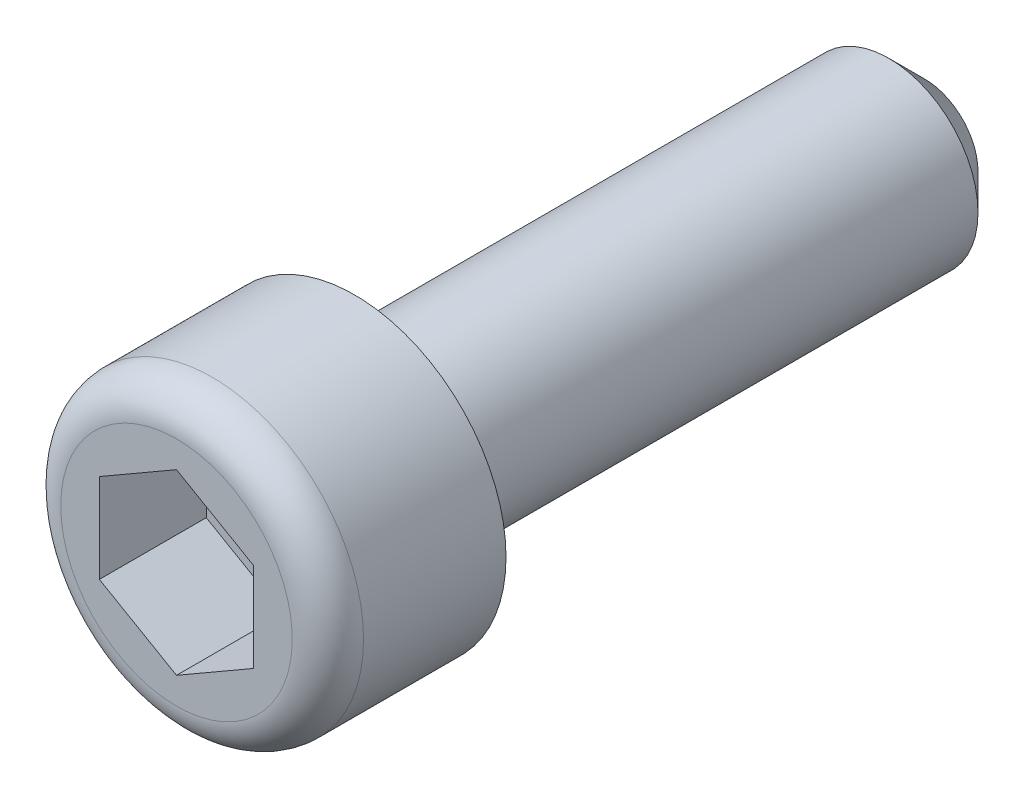
ISO-10303-21;
HEADER;
FILE_DESCRIPTION(('STEP AP214'),'2;1');
FILE_NAME('part.step','',(''),(''),'','','');
FILE_SCHEMA(('AUTOMOTIVE_DESIGN { 1 0 10303 214 1 1 1 1 }'));
ENDSEC;
DATA;
#1=APPLICATION_CONTEXT('core data for automotive mechanical design processes');
#2=APPLICATION_PROTOCOL_DEFINITION('international standard','automotive_design',2000,#1);
#3=PRODUCT_CONTEXT('',#1,'mechanical');
#4=PRODUCT('Part','Part','',(#3));
#5=PRODUCT_RELATED_PRODUCT_CATEGORY('part','',(#4));
#6=PRODUCT_DEFINITION_FORMATION('','',#4);
#7=PRODUCT_DEFINITION_CONTEXT('part definition',#1,'design');
#8=PRODUCT_DEFINITION('design','',#6,#7);
#9=PRODUCT_DEFINITION_SHAPE('','',#8);
#10=(LENGTH_UNIT() NAMED_UNIT(*) SI_UNIT(.MILLI.,.METRE.));
#11=(NAMED_UNIT(*) PLANE_ANGLE_UNIT() SI_UNIT($,.RADIAN.));
#12=(NAMED_UNIT(*) SI_UNIT($,.STERADIAN.) SOLID_ANGLE_UNIT());
#13=UNCERTAINTY_MEASURE_WITH_UNIT(LENGTH_MEASURE(1.E-05),#10,'distance_accuracy_value','');
#14=(GEOMETRIC_REPRESENTATION_CONTEXT(3) GLOBAL_UNCERTAINTY_ASSIGNED_CONTEXT((#13)) GLOBAL_UNIT_ASSIGNED_CONTEXT((#10,
#11,#12)) REPRESENTATION_CONTEXT('',''));
#15=CARTESIAN_POINT('',(0.,0.,0.));
#16=DIRECTION('',(0.,0.,1.));
#17=DIRECTION('',(1.,0.,0.));
#18=AXIS2_PLACEMENT_3D('',#15,#16,#17);
#19=CARTESIAN_POINT('',(0.,0.,0.));
#20=DIRECTION('',(0.,0.,-1.));
#21=DIRECTION('',(-1.,0.,0.));
#22=AXIS2_PLACEMENT_3D('',#19,#20,#21);
#23=PLANE('',#22);
#24=CARTESIAN_POINT('',(0.,0.,0.));
#25=DIRECTION('',(0.,0.,-1.));
#26=DIRECTION('',(-1.,0.,0.));
#27=AXIS2_PLACEMENT_3D('',#24,#25,#26);
#28=CIRCLE('',#27,3.25);
#29=CARTESIAN_POINT('',(-3.25,0.,0.));
#30=VERTEX_POINT('',#29);
#31=EDGE_CURVE('E41',#30,#30,#28,.F.);
#32=ORIENTED_EDGE('',*,*,#31,.T.);
#33=EDGE_LOOP('',(#32));
#34=FACE_BOUND('',#33,.T.);
#35=DIRECTION('',(-0.866025403784439,-0.5,0.));
#36=VECTOR('',#35,1.);
#37=CARTESIAN_POINT('',(0.,2.5,0.));
#38=LINE('',#37,#36);
#39=CARTESIAN_POINT('',(0.,2.5,0.));
#40=VERTEX_POINT('',#39);
#41=CARTESIAN_POINT('',(-2.1650635094611,1.25,0.));
#42=VERTEX_POINT('',#41);
#43=EDGE_CURVE('E122',#40,#42,#38,.T.);
#44=ORIENTED_EDGE('',*,*,#43,.F.);
#45=DIRECTION('',(-0.866025403784439,0.5,0.));
#46=VECTOR('',#45,1.);
#47=CARTESIAN_POINT('',(2.1650635094611,1.25,0.));
#48=LINE('',#47,#46);
#49=CARTESIAN_POINT('',(2.1650635094611,1.25,0.));
#50=VERTEX_POINT('',#49);
#51=EDGE_CURVE('E48',#50,#40,#48,.T.);
#52=ORIENTED_EDGE('',*,*,#51,.F.);
#53=DIRECTION('',(0.,1.,0.));
#54=VECTOR('',#53,1.);
#55=CARTESIAN_POINT('',(2.1650635094611,-1.25,0.));
#56=LINE('',#55,#54);
#57=CARTESIAN_POINT('',(2.1650635094611,-1.25,0.));
#58=VERTEX_POINT('',#57);
#59=EDGE_CURVE('E131',#58,#50,#56,.T.);
#60=ORIENTED_EDGE('',*,*,#59,.F.);
#61=DIRECTION('',(0.866025403784439,0.5,0.));
#62=VECTOR('',#61,1.);
#63=CARTESIAN_POINT('',(0.,-2.5,0.));
#64=LINE('',#63,#62);
#65=CARTESIAN_POINT('',(0.,-2.5,0.));
#66=VERTEX_POINT('',#65);
#67=EDGE_CURVE('E129',#66,#58,#64,.T.);
#68=ORIENTED_EDGE('',*,*,#67,.F.);
#69=DIRECTION('',(0.866025403784439,-0.5,0.));
#70=VECTOR('',#69,1.);
#71=CARTESIAN_POINT('',(-2.1650635094611,-1.25,0.));
#72=LINE('',#71,#70);
#73=CARTESIAN_POINT('',(-2.1650635094611,-1.25,0.));
#74=VERTEX_POINT('',#73);
#75=EDGE_CURVE('E96',#74,#66,#72,.T.);
#76=ORIENTED_EDGE('',*,*,#75,.F.);
#77=DIRECTION('',(0.,-1.,0.));
#78=VECTOR('',#77,1.);
#79=CARTESIAN_POINT('',(-2.1650635094611,1.25,0.));
#80=LINE('',#79,#78);
#81=EDGE_CURVE('E125',#42,#74,#80,.T.);
#82=ORIENTED_EDGE('',*,*,#81,.F.);
#83=EDGE_LOOP('',(#44,#52,#60,#68,#76,#82));
#84=FACE_BOUND('',#83,.T.);
#85=ADVANCED_FACE('F33',(#34,#84),#23,.F.);
#86=CARTESIAN_POINT('',(0.,0.,156.291575098795));
#87=DIRECTION('',(0.,0.,1.));
#88=DIRECTION('',(1.,0.,0.));
#89=AXIS2_PLACEMENT_3D('',#86,#87,#88);
#90=CYLINDRICAL_SURFACE('',#89,4.25);
#91=CARTESIAN_POINT('',(0.,0.,-1.));
#92=DIRECTION('',(0.,0.,-1.));
#93=DIRECTION('',(-1.,0.,0.));
#94=AXIS2_PLACEMENT_3D('',#91,#92,#93);
#95=CIRCLE('',#94,4.25);
#96=CARTESIAN_POINT('',(-4.25,0.,-1.));
#97=VERTEX_POINT('',#96);
#98=EDGE_CURVE('E11',#97,#97,#95,.T.);
#99=ORIENTED_EDGE('',*,*,#98,.T.);
#100=EDGE_LOOP('',(#99));
#101=FACE_BOUND('',#100,.T.);
#102=CARTESIAN_POINT('',(0.,0.,-5.));
#103=DIRECTION('',(0.,0.,1.));
#104=DIRECTION('',(1.,0.,0.));
#105=AXIS2_PLACEMENT_3D('',#102,#103,#104);
#106=CIRCLE('',#105,4.25);
#107=CARTESIAN_POINT('',(4.25,0.,-5.));
#108=VERTEX_POINT('',#107);
#109=EDGE_CURVE('E143',#108,#108,#106,.T.);
#110=ORIENTED_EDGE('',*,*,#109,.T.);
#111=EDGE_LOOP('',(#110));
#112=FACE_BOUND('',#111,.T.);
#113=ADVANCED_FACE('F165',(#101,#112),#90,.T.);
#114=CARTESIAN_POINT('',(0.,4.25,-5.));
#115=DIRECTION('',(0.,0.,1.));
#116=DIRECTION('',(1.,0.,0.));
#117=AXIS2_PLACEMENT_3D('',#114,#115,#116);
#118=PLANE('',#117);
#119=ORIENTED_EDGE('',*,*,#109,.F.);
#120=EDGE_LOOP('',(#119));
#121=FACE_BOUND('',#120,.T.);
#122=CARTESIAN_POINT('',(0.,0.,-5.));
#123=DIRECTION('',(0.,0.,1.));
#124=DIRECTION('',(1.,0.,0.));
#125=AXIS2_PLACEMENT_3D('',#122,#123,#124);
#126=CIRCLE('',#125,2.5);
#127=CARTESIAN_POINT('',(2.5,0.,-5.));
#128=VERTEX_POINT('',#127);
#129=EDGE_CURVE('E135',#128,#128,#126,.T.);
#130=ORIENTED_EDGE('',*,*,#129,.T.);
#131=EDGE_LOOP('',(#130));
#132=FACE_BOUND('',#131,.T.);
#133=ADVANCED_FACE('F170',(#121,#132),#118,.F.);
#134=CARTESIAN_POINT('',(0.,0.,156.291575098795));
#135=DIRECTION('',(0.,0.,1.));
#136=DIRECTION('',(1.,0.,0.));
#137=AXIS2_PLACEMENT_3D('',#134,#135,#136);
#138=CYLINDRICAL_SURFACE('',#137,2.5);
#139=CARTESIAN_POINT('',(0.,0.,-20.));
#140=DIRECTION('',(0.,0.,1.));
#141=DIRECTION('',(1.,0.,0.));
#142=AXIS2_PLACEMENT_3D('',#139,#140,#141);
#143=CIRCLE('',#142,2.5);
#144=CARTESIAN_POINT('',(2.5,0.,-20.));
#145=VERTEX_POINT('',#144);
#146=EDGE_CURVE('E146',#145,#145,#143,.T.);
#147=ORIENTED_EDGE('',*,*,#146,.T.);
#148=EDGE_LOOP('',(#147));
#149=FACE_BOUND('',#148,.T.);
#150=ORIENTED_EDGE('',*,*,#129,.F.);
#151=EDGE_LOOP('',(#150));
#152=FACE_BOUND('',#151,.T.);
#153=ADVANCED_FACE('F176',(#149,#152),#138,.T.);
#154=CARTESIAN_POINT('',(0.,2.5,-21.));
#155=DIRECTION('',(0.,0.,1.));
#156=DIRECTION('',(1.,0.,0.));
#157=AXIS2_PLACEMENT_3D('',#154,#155,#156);
#158=PLANE('',#157);
#159=CARTESIAN_POINT('',(0.,0.,-21.));
#160=DIRECTION('',(0.,0.,1.));
#161=DIRECTION('',(1.,0.,0.));
#162=AXIS2_PLACEMENT_3D('',#159,#160,#161);
#163=CIRCLE('',#162,1.49999999999999);
#164=CARTESIAN_POINT('',(1.49999999999999,0.,-21.));
#165=VERTEX_POINT('',#164);
#166=EDGE_CURVE('E149',#165,#165,#163,.F.);
#167=ORIENTED_EDGE('',*,*,#166,.T.);
#168=EDGE_LOOP('',(#167));
#169=FACE_BOUND('',#168,.T.);
#170=ADVANCED_FACE('F180',(#169),#158,.F.);
#171=CARTESIAN_POINT('',(2.1650635094611,1.25,-3.));
#172=DIRECTION('',(0.5,0.866025403784438,0.));
#173=DIRECTION('',(-0.866025403784439,0.5,0.));
#174=AXIS2_PLACEMENT_3D('',#171,#172,#173);
#175=PLANE('',#174);
#176=ORIENTED_EDGE('',*,*,#51,.T.);
#177=DIRECTION('',(0.,0.,1.));
#178=VECTOR('',#177,1.);
#179=CARTESIAN_POINT('',(0.,2.5,-3.));
#180=LINE('',#179,#178);
#181=CARTESIAN_POINT('',(0.,2.5,-3.));
#182=VERTEX_POINT('',#181);
#183=EDGE_CURVE('E78',#182,#40,#180,.T.);
#184=ORIENTED_EDGE('',*,*,#183,.F.);
#185=DIRECTION('',(-0.866025403784439,0.5,0.));
#186=VECTOR('',#185,1.);
#187=CARTESIAN_POINT('',(2.1650635094611,1.25,-3.));
#188=LINE('',#187,#186);
#189=CARTESIAN_POINT('',(2.1650635094611,1.25,-3.));
#190=VERTEX_POINT('',#189);
#191=EDGE_CURVE('E133',#190,#182,#188,.T.);
#192=ORIENTED_EDGE('',*,*,#191,.F.);
#193=DIRECTION('',(0.,0.,1.));
#194=VECTOR('',#193,1.);
#195=CARTESIAN_POINT('',(2.1650635094611,1.25,-3.));
#196=LINE('',#195,#194);
#197=EDGE_CURVE('E56',#190,#50,#196,.T.);
#198=ORIENTED_EDGE('',*,*,#197,.T.);
#199=EDGE_LOOP('',(#176,#184,#192,#198));
#200=FACE_BOUND('',#199,.T.);
#201=ADVANCED_FACE('F184',(#200),#175,.F.);
#202=CARTESIAN_POINT('',(2.1650635094611,-1.25,-3.));
#203=DIRECTION('',(1.,0.,0.));
#204=DIRECTION('',(0.,0.,-1.));
#205=AXIS2_PLACEMENT_3D('',#202,#203,#204);
#206=PLANE('',#205);
#207=ORIENTED_EDGE('',*,*,#59,.T.);
#208=ORIENTED_EDGE('',*,*,#197,.F.);
#209=DIRECTION('',(0.,1.,0.));
#210=VECTOR('',#209,1.);
#211=CARTESIAN_POINT('',(2.1650635094611,-1.25,-3.));
#212=LINE('',#211,#210);
#213=CARTESIAN_POINT('',(2.1650635094611,-1.25,-3.));
#214=VERTEX_POINT('',#213);
#215=EDGE_CURVE('E108',#214,#190,#212,.T.);
#216=ORIENTED_EDGE('',*,*,#215,.F.);
#217=DIRECTION('',(0.,0.,1.));
#218=VECTOR('',#217,1.);
#219=CARTESIAN_POINT('',(2.1650635094611,-1.25,-3.));
#220=LINE('',#219,#218);
#221=EDGE_CURVE('E100',#214,#58,#220,.T.);
#222=ORIENTED_EDGE('',*,*,#221,.T.);
#223=EDGE_LOOP('',(#207,#208,#216,#222));
#224=FACE_BOUND('',#223,.T.);
#225=ADVANCED_FACE('F188',(#224),#206,.F.);
#226=CARTESIAN_POINT('',(0.,-2.5,-3.));
#227=DIRECTION('',(0.5,-0.866025403784439,0.));
#228=DIRECTION('',(0.866025403784439,0.5,0.));
#229=AXIS2_PLACEMENT_3D('',#226,#227,#228);
#230=PLANE('',#229);
#231=ORIENTED_EDGE('',*,*,#67,.T.);
#232=ORIENTED_EDGE('',*,*,#221,.F.);
#233=DIRECTION('',(0.866025403784439,0.5,0.));
#234=VECTOR('',#233,1.);
#235=CARTESIAN_POINT('',(0.,-2.5,-3.));
#236=LINE('',#235,#234);
#237=CARTESIAN_POINT('',(0.,-2.5,-3.));
#238=VERTEX_POINT('',#237);
#239=EDGE_CURVE('E104',#238,#214,#236,.T.);
#240=ORIENTED_EDGE('',*,*,#239,.F.);
#241=DIRECTION('',(0.,0.,1.));
#242=VECTOR('',#241,1.);
#243=CARTESIAN_POINT('',(0.,-2.5,-3.));
#244=LINE('',#243,#242);
#245=EDGE_CURVE('E89',#238,#66,#244,.T.);
#246=ORIENTED_EDGE('',*,*,#245,.T.);
#247=EDGE_LOOP('',(#231,#232,#240,#246));
#248=FACE_BOUND('',#247,.T.);
#249=ADVANCED_FACE('F105',(#248),#230,.F.);
#250=CARTESIAN_POINT('',(-2.1650635094611,-1.25,-3.));
#251=DIRECTION('',(-0.5,-0.866025403784438,0.));
#252=DIRECTION('',(0.866025403784439,-0.5,0.));
#253=AXIS2_PLACEMENT_3D('',#250,#251,#252);
#254=PLANE('',#253);
#255=ORIENTED_EDGE('',*,*,#75,.T.);
#256=ORIENTED_EDGE('',*,*,#245,.F.);
#257=DIRECTION('',(0.866025403784439,-0.5,0.));
#258=VECTOR('',#257,1.);
#259=CARTESIAN_POINT('',(-2.1650635094611,-1.25,-3.));
#260=LINE('',#259,#258);
#261=CARTESIAN_POINT('',(-2.1650635094611,-1.25,-3.));
#262=VERTEX_POINT('',#261);
#263=EDGE_CURVE('E93',#262,#238,#260,.T.);
#264=ORIENTED_EDGE('',*,*,#263,.F.);
#265=DIRECTION('',(0.,0.,1.));
#266=VECTOR('',#265,1.);
#267=CARTESIAN_POINT('',(-2.1650635094611,-1.25,-3.));
#268=LINE('',#267,#266);
#269=EDGE_CURVE('E101',#262,#74,#268,.T.);
#270=ORIENTED_EDGE('',*,*,#269,.T.);
#271=EDGE_LOOP('',(#255,#256,#264,#270));
#272=FACE_BOUND('',#271,.T.);
#273=ADVANCED_FACE('F91',(#272),#254,.F.);
#274=CARTESIAN_POINT('',(-2.1650635094611,1.25,-3.));
#275=DIRECTION('',(-1.,0.,0.));
#276=DIRECTION('',(0.,-1.,0.));
#277=AXIS2_PLACEMENT_3D('',#274,#275,#276);
#278=PLANE('',#277);
#279=ORIENTED_EDGE('',*,*,#81,.T.);
#280=ORIENTED_EDGE('',*,*,#269,.F.);
#281=DIRECTION('',(0.,-1.,0.));
#282=VECTOR('',#281,1.);
#283=CARTESIAN_POINT('',(-2.1650635094611,1.25,-3.));
#284=LINE('',#283,#282);
#285=CARTESIAN_POINT('',(-2.1650635094611,1.25,-3.));
#286=VERTEX_POINT('',#285);
#287=EDGE_CURVE('E114',#286,#262,#284,.T.);
#288=ORIENTED_EDGE('',*,*,#287,.F.);
#289=DIRECTION('',(0.,0.,1.));
#290=VECTOR('',#289,1.);
#291=CARTESIAN_POINT('',(-2.1650635094611,1.25,-3.));
#292=LINE('',#291,#290);
#293=EDGE_CURVE('E138',#286,#42,#292,.T.);
#294=ORIENTED_EDGE('',*,*,#293,.T.);
#295=EDGE_LOOP('',(#279,#280,#288,#294));
#296=FACE_BOUND('',#295,.T.);
#297=ADVANCED_FACE('F192',(#296),#278,.F.);
#298=CARTESIAN_POINT('',(0.,2.5,-3.));
#299=DIRECTION('',(-0.5,0.866025403784439,0.));
#300=DIRECTION('',(-0.866025403784439,-0.5,0.));
#301=AXIS2_PLACEMENT_3D('',#298,#299,#300);
#302=PLANE('',#301);
#303=ORIENTED_EDGE('',*,*,#43,.T.);
#304=ORIENTED_EDGE('',*,*,#293,.F.);
#305=DIRECTION('',(-0.866025403784439,-0.5,0.));
#306=VECTOR('',#305,1.);
#307=CARTESIAN_POINT('',(0.,2.5,-3.));
#308=LINE('',#307,#306);
#309=EDGE_CURVE('E116',#182,#286,#308,.T.);
#310=ORIENTED_EDGE('',*,*,#309,.F.);
#311=ORIENTED_EDGE('',*,*,#183,.T.);
#312=EDGE_LOOP('',(#303,#304,#310,#311));
#313=FACE_BOUND('',#312,.T.);
#314=ADVANCED_FACE('F189',(#313),#302,.F.);
#315=CARTESIAN_POINT('',(0.,0.,-3.));
#316=DIRECTION('',(0.,0.,1.));
#317=DIRECTION('',(1.,0.,0.));
#318=AXIS2_PLACEMENT_3D('',#315,#316,#317);
#319=PLANE('',#318);
#320=ORIENTED_EDGE('',*,*,#191,.T.);
#321=ORIENTED_EDGE('',*,*,#309,.T.);
#322=ORIENTED_EDGE('',*,*,#287,.T.);
#323=ORIENTED_EDGE('',*,*,#263,.T.);
#324=ORIENTED_EDGE('',*,*,#239,.T.);
#325=ORIENTED_EDGE('',*,*,#215,.T.);
#326=EDGE_LOOP('',(#320,#321,#322,#323,#324,#325));
#327=FACE_BOUND('',#326,.T.);
#328=ADVANCED_FACE('F111',(#327),#319,.T.);
#329=CARTESIAN_POINT('',(0.,0.,-20.));
#330=DIRECTION('',(0.,0.,1.));
#331=DIRECTION('',(1.,0.,0.));
#332=AXIS2_PLACEMENT_3D('',#329,#330,#331);
#333=CONICAL_SURFACE('',#332,2.5,0.785398163397449);
#334=ORIENTED_EDGE('',*,*,#166,.F.);
#335=EDGE_LOOP('',(#334));
#336=FACE_BOUND('',#335,.T.);
#337=ORIENTED_EDGE('',*,*,#146,.F.);
#338=EDGE_LOOP('',(#337));
#339=FACE_BOUND('',#338,.T.);
#340=ADVANCED_FACE('F157',(#336,#339),#333,.T.);
#341=CARTESIAN_POINT('',(0.,0.,-1.));
#342=DIRECTION('',(0.,0.,-1.));
#343=DIRECTION('',(-1.,0.,0.));
#344=AXIS2_PLACEMENT_3D('',#341,#342,#343);
#345=TOROIDAL_SURFACE('',#344,3.25,1.);
#346=ORIENTED_EDGE('',*,*,#98,.F.);
#347=EDGE_LOOP('',(#346));
#348=FACE_BOUND('',#347,.T.);
#349=ORIENTED_EDGE('',*,*,#31,.F.);
#350=EDGE_LOOP('',(#349));
#351=FACE_BOUND('',#350,.T.);
#352=ADVANCED_FACE('F35',(#348,#351),#345,.T.);
#353=CLOSED_SHELL('',(#85,#113,#133,#153,#170,#201,#225,#249,#273,#297,#314,#328,#340,#352));
#354=MANIFOLD_SOLID_BREP('B2',#353);
#355=ADVANCED_BREP_SHAPE_REPRESENTATION('',(#18,#354),#14);
#356=SHAPE_DEFINITION_REPRESENTATION(#9,#355);
ENDSEC;
END-ISO-10303-21;
